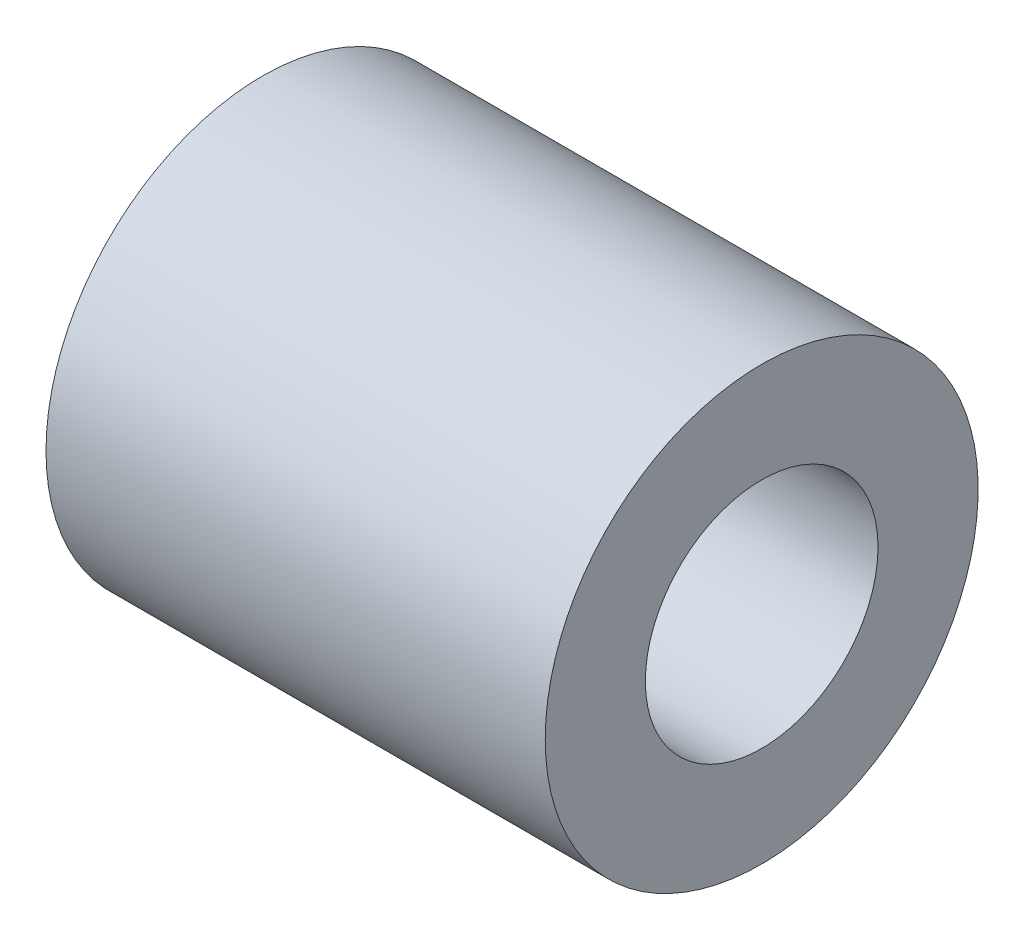
ISO-10303-21;
HEADER;
FILE_DESCRIPTION(('STEP AP214'),'2;1');
FILE_NAME('part.step','',(''),(''),'','','');
FILE_SCHEMA(('AUTOMOTIVE_DESIGN { 1 0 10303 214 1 1 1 1 }'));
ENDSEC;
DATA;
#1=APPLICATION_CONTEXT('core data for automotive mechanical design processes');
#2=APPLICATION_PROTOCOL_DEFINITION('international standard','automotive_design',2000,#1);
#3=PRODUCT_CONTEXT('',#1,'mechanical');
#4=PRODUCT('Part','Part','',(#3));
#5=PRODUCT_RELATED_PRODUCT_CATEGORY('part','',(#4));
#6=PRODUCT_DEFINITION_FORMATION('','',#4);
#7=PRODUCT_DEFINITION_CONTEXT('part definition',#1,'design');
#8=PRODUCT_DEFINITION('design','',#6,#7);
#9=PRODUCT_DEFINITION_SHAPE('','',#8);
#10=(LENGTH_UNIT() NAMED_UNIT(*) SI_UNIT(.MILLI.,.METRE.));
#11=(NAMED_UNIT(*) PLANE_ANGLE_UNIT() SI_UNIT($,.RADIAN.));
#12=(NAMED_UNIT(*) SI_UNIT($,.STERADIAN.) SOLID_ANGLE_UNIT());
#13=UNCERTAINTY_MEASURE_WITH_UNIT(LENGTH_MEASURE(1.E-05),#10,'distance_accuracy_value','');
#14=(GEOMETRIC_REPRESENTATION_CONTEXT(3) GLOBAL_UNCERTAINTY_ASSIGNED_CONTEXT((#13)) GLOBAL_UNIT_ASSIGNED_CONTEXT((#10,
#11,#12)) REPRESENTATION_CONTEXT('',''));
#15=CARTESIAN_POINT('',(0.,0.,0.));
#16=DIRECTION('',(0.,0.,1.));
#17=DIRECTION('',(1.,0.,0.));
#18=AXIS2_PLACEMENT_3D('',#15,#16,#17);
#19=CARTESIAN_POINT('',(-40.75,11.694326346384,29.6496576878358));
#20=DIRECTION('',(1.,0.,0.));
#21=DIRECTION('',(0.,0.,-1.));
#22=AXIS2_PLACEMENT_3D('',#19,#20,#21);
#23=PLANE('',#22);
#24=CARTESIAN_POINT('',(-40.75,21.,5.94999999999998));
#25=DIRECTION('',(1.,0.,0.));
#26=DIRECTION('',(0.,0.,-1.));
#27=AXIS2_PLACEMENT_3D('',#24,#25,#26);
#28=CIRCLE('',#27,2.15);
#29=CARTESIAN_POINT('',(-40.75,21.,3.79999999999998));
#30=VERTEX_POINT('',#29);
#31=EDGE_CURVE('E50',#30,#30,#28,.T.);
#32=ORIENTED_EDGE('',*,*,#31,.T.);
#33=EDGE_LOOP('',(#32));
#34=FACE_BOUND('',#33,.T.);
#35=CARTESIAN_POINT('',(-40.75,21.,5.94999999999998));
#36=DIRECTION('',(-1.,0.,0.));
#37=DIRECTION('',(0.,0.,1.));
#38=AXIS2_PLACEMENT_3D('',#35,#36,#37);
#39=CIRCLE('',#38,4.);
#40=CARTESIAN_POINT('',(-40.75,21.,9.94999999999999));
#41=VERTEX_POINT('',#40);
#42=EDGE_CURVE('E41',#41,#41,#39,.T.);
#43=ORIENTED_EDGE('',*,*,#42,.T.);
#44=EDGE_LOOP('',(#43));
#45=FACE_BOUND('',#44,.T.);
#46=ADVANCED_FACE('F37',(#34,#45),#23,.F.);
#47=CARTESIAN_POINT('',(-31.525,21.,5.94999999999998));
#48=DIRECTION('',(-1.,0.,0.));
#49=DIRECTION('',(0.,0.,1.));
#50=AXIS2_PLACEMENT_3D('',#47,#48,#49);
#51=PLANE('',#50);
#52=CARTESIAN_POINT('',(-31.525,21.,5.94999999999998));
#53=DIRECTION('',(-1.,0.,0.));
#54=DIRECTION('',(0.,0.,1.));
#55=AXIS2_PLACEMENT_3D('',#52,#53,#54);
#56=CIRCLE('',#55,2.15);
#57=CARTESIAN_POINT('',(-31.525,21.,8.09999999999998));
#58=VERTEX_POINT('',#57);
#59=EDGE_CURVE('E45',#58,#58,#56,.T.);
#60=ORIENTED_EDGE('',*,*,#59,.T.);
#61=EDGE_LOOP('',(#60));
#62=FACE_BOUND('',#61,.T.);
#63=CARTESIAN_POINT('',(-31.525,21.,5.94999999999998));
#64=DIRECTION('',(-1.,0.,0.));
#65=DIRECTION('',(0.,0.,1.));
#66=AXIS2_PLACEMENT_3D('',#63,#64,#65);
#67=CIRCLE('',#66,4.);
#68=CARTESIAN_POINT('',(-31.525,21.,9.94999999999998));
#69=VERTEX_POINT('',#68);
#70=EDGE_CURVE('E10',#69,#69,#67,.T.);
#71=ORIENTED_EDGE('',*,*,#70,.F.);
#72=EDGE_LOOP('',(#71));
#73=FACE_BOUND('',#72,.T.);
#74=ADVANCED_FACE('F61',(#62,#73),#51,.F.);
#75=CARTESIAN_POINT('',(-45.952,21.,5.94999999999998));
#76=DIRECTION('',(1.,0.,0.));
#77=DIRECTION('',(0.,0.,-1.));
#78=AXIS2_PLACEMENT_3D('',#75,#76,#77);
#79=CYLINDRICAL_SURFACE('',#78,4.);
#80=ORIENTED_EDGE('',*,*,#70,.T.);
#81=EDGE_LOOP('',(#80));
#82=FACE_BOUND('',#81,.T.);
#83=ORIENTED_EDGE('',*,*,#42,.F.);
#84=EDGE_LOOP('',(#83));
#85=FACE_BOUND('',#84,.T.);
#86=ADVANCED_FACE('F39',(#82,#85),#79,.T.);
#87=CARTESIAN_POINT('',(-45.952,21.,5.94999999999998));
#88=DIRECTION('',(1.,0.,0.));
#89=DIRECTION('',(0.,0.,-1.));
#90=AXIS2_PLACEMENT_3D('',#87,#88,#89);
#91=CYLINDRICAL_SURFACE('',#90,2.15);
#92=ORIENTED_EDGE('',*,*,#31,.F.);
#93=EDGE_LOOP('',(#92));
#94=FACE_BOUND('',#93,.T.);
#95=ORIENTED_EDGE('',*,*,#59,.F.);
#96=EDGE_LOOP('',(#95));
#97=FACE_BOUND('',#96,.T.);
#98=ADVANCED_FACE('F60',(#94,#97),#91,.F.);
#99=CLOSED_SHELL('',(#46,#74,#86,#98));
#100=MANIFOLD_SOLID_BREP('B2',#99);
#101=ADVANCED_BREP_SHAPE_REPRESENTATION('',(#18,#100),#14);
#102=SHAPE_DEFINITION_REPRESENTATION(#9,#101);
ENDSEC;
END-ISO-10303-21;
